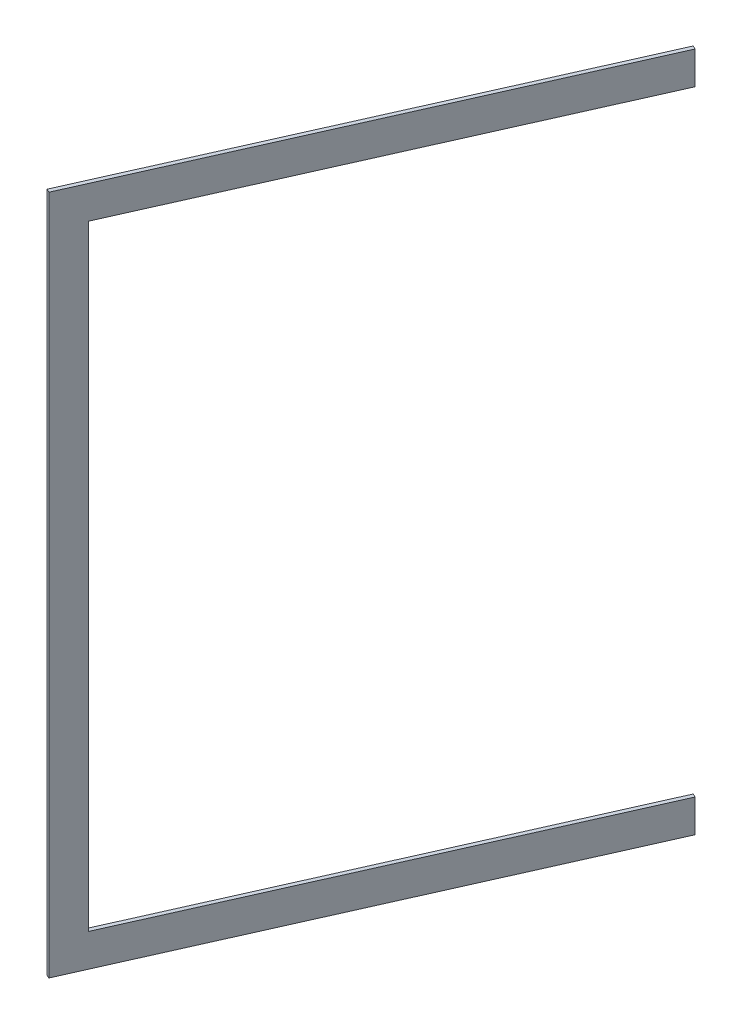
ISO-10303-21;
HEADER;
FILE_DESCRIPTION(('STEP AP214'),'2;1');
FILE_NAME('part.step','',(''),(''),'','','');
FILE_SCHEMA(('AUTOMOTIVE_DESIGN { 1 0 10303 214 1 1 1 1 }'));
ENDSEC;
DATA;
#1=APPLICATION_CONTEXT('core data for automotive mechanical design processes');
#2=APPLICATION_PROTOCOL_DEFINITION('international standard','automotive_design',2000,#1);
#3=PRODUCT_CONTEXT('',#1,'mechanical');
#4=PRODUCT('Part','Part','',(#3));
#5=PRODUCT_RELATED_PRODUCT_CATEGORY('part','',(#4));
#6=PRODUCT_DEFINITION_FORMATION('','',#4);
#7=PRODUCT_DEFINITION_CONTEXT('part definition',#1,'design');
#8=PRODUCT_DEFINITION('design','',#6,#7);
#9=PRODUCT_DEFINITION_SHAPE('','',#8);
#10=(LENGTH_UNIT() NAMED_UNIT(*) SI_UNIT(.MILLI.,.METRE.));
#11=(NAMED_UNIT(*) PLANE_ANGLE_UNIT() SI_UNIT($,.RADIAN.));
#12=(NAMED_UNIT(*) SI_UNIT($,.STERADIAN.) SOLID_ANGLE_UNIT());
#13=UNCERTAINTY_MEASURE_WITH_UNIT(LENGTH_MEASURE(1.E-05),#10,'distance_accuracy_value','');
#14=(GEOMETRIC_REPRESENTATION_CONTEXT(3) GLOBAL_UNCERTAINTY_ASSIGNED_CONTEXT((#13)) GLOBAL_UNIT_ASSIGNED_CONTEXT((#10,
#11,#12)) REPRESENTATION_CONTEXT('',''));
#15=CARTESIAN_POINT('',(0.,0.,0.));
#16=DIRECTION('',(0.,0.,1.));
#17=DIRECTION('',(1.,0.,0.));
#18=AXIS2_PLACEMENT_3D('',#15,#16,#17);
#19=CARTESIAN_POINT('',(440.298141294768,-2540.0250000008,1615.47743897948));
#20=DIRECTION('',(0.913545457642601,0.,0.4067366430758));
#21=DIRECTION('',(0.4067366430758,0.,-0.913545457642601));
#22=AXIS2_PLACEMENT_3D('',#19,#20,#21);
#23=PLANE('',#22);
#24=DIRECTION('',(0.406736643076131,0.,-0.913545457642454));
#25=VECTOR('',#24,1.);
#26=CARTESIAN_POINT('',(355.48626156987,-2241.55,1805.96803970516));
#27=LINE('',#26,#25);
#28=CARTESIAN_POINT('',(355.486261569905,-2241.55000000001,1805.96803970518));
#29=VERTEX_POINT('',#28);
#30=CARTESIAN_POINT('',(536.880608193707,-2241.55,1398.54966661008));
#31=VERTEX_POINT('',#30);
#32=EDGE_CURVE('E90',#29,#31,#27,.T.);
#33=ORIENTED_EDGE('',*,*,#32,.T.);
#34=DIRECTION('',(0.,1.,0.));
#35=VECTOR('',#34,1.);
#36=CARTESIAN_POINT('',(536.88060819371,-1953.1600000001,1398.54966661008));
#37=LINE('',#36,#35);
#38=CARTESIAN_POINT('',(536.880608193707,-2209.8,1398.54966661008));
#39=VERTEX_POINT('',#38);
#40=EDGE_CURVE('E20',#31,#39,#37,.T.);
#41=ORIENTED_EDGE('',*,*,#40,.T.);
#42=DIRECTION('',(0.406736643075846,0.,-0.91354545764258));
#43=VECTOR('',#42,1.);
#44=CARTESIAN_POINT('',(343.688837465502,-2209.8,1832.46548808125));
#45=LINE('',#44,#43);
#46=CARTESIAN_POINT('',(343.688837465506,-2209.8,1832.46548808125));
#47=VERTEX_POINT('',#46);
#48=EDGE_CURVE('E79',#47,#39,#45,.T.);
#49=ORIENTED_EDGE('',*,*,#48,.F.);
#50=DIRECTION('',(0.,1.,0.));
#51=VECTOR('',#50,1.);
#52=CARTESIAN_POINT('',(343.688837465502,-3126.84000000066,1832.46548808125));
#53=LINE('',#52,#51);
#54=CARTESIAN_POINT('',(343.688837465506,-2870.2,1832.46548808125));
#55=VERTEX_POINT('',#54);
#56=EDGE_CURVE('E98',#47,#55,#53,.F.);
#57=ORIENTED_EDGE('',*,*,#56,.T.);
#58=DIRECTION('',(0.406736643075846,0.,-0.91354545764258));
#59=VECTOR('',#58,1.);
#60=CARTESIAN_POINT('',(343.688837465502,-2870.2,1832.46548808125));
#61=LINE('',#60,#59);
#62=CARTESIAN_POINT('',(536.880608193707,-2870.2,1398.54966661008));
#63=VERTEX_POINT('',#62);
#64=EDGE_CURVE('E105',#55,#63,#61,.T.);
#65=ORIENTED_EDGE('',*,*,#64,.T.);
#66=DIRECTION('',(0.,1.,0.));
#67=VECTOR('',#66,1.);
#68=CARTESIAN_POINT('',(536.88060819371,-3126.84000000066,1398.54966661008));
#69=LINE('',#68,#67);
#70=CARTESIAN_POINT('',(536.880608193707,-2838.45,1398.54966661008));
#71=VERTEX_POINT('',#70);
#72=EDGE_CURVE('E108',#71,#63,#69,.F.);
#73=ORIENTED_EDGE('',*,*,#72,.F.);
#74=DIRECTION('',(0.406736643076131,0.,-0.913545457642454));
#75=VECTOR('',#74,1.);
#76=CARTESIAN_POINT('',(355.48626156987,-2838.45,1805.96803970516));
#77=LINE('',#76,#75);
#78=CARTESIAN_POINT('',(355.486261569905,-2838.45000000001,1805.96803970518));
#79=VERTEX_POINT('',#78);
#80=EDGE_CURVE('E112',#79,#71,#77,.T.);
#81=ORIENTED_EDGE('',*,*,#80,.F.);
#82=DIRECTION('',(0.,1.,0.));
#83=VECTOR('',#82,1.);
#84=CARTESIAN_POINT('',(355.48626156987,497460.000000032,1805.96803970516));
#85=LINE('',#84,#83);
#86=EDGE_CURVE('E119',#79,#29,#85,.T.);
#87=ORIENTED_EDGE('',*,*,#86,.T.);
#88=EDGE_LOOP('',(#33,#41,#49,#57,#65,#73,#81,#87));
#89=FACE_BOUND('',#88,.T.);
#90=ADVANCED_FACE('F17',(#89),#23,.T.);
#91=CARTESIAN_POINT('',(536.88060819371,-1953.1600000001,1398.54966661008));
#92=DIRECTION('',(-0.4067366430758,0.,0.913545457642601));
#93=DIRECTION('',(0.913545457642601,0.,0.4067366430758));
#94=AXIS2_PLACEMENT_3D('',#91,#92,#93);
#95=PLANE('',#94);
#96=ORIENTED_EDGE('',*,*,#40,.F.);
#97=DIRECTION('',(-0.913545457649993,0.,-0.406736643059198));
#98=VECTOR('',#97,1.);
#99=CARTESIAN_POINT('',(536.88060819371,-2241.55,1398.54966661008));
#100=LINE('',#99,#98);
#101=CARTESIAN_POINT('',(533.400000000012,-2241.55,1396.99999999997));
#102=VERTEX_POINT('',#101);
#103=EDGE_CURVE('E123',#31,#102,#100,.T.);
#104=ORIENTED_EDGE('',*,*,#103,.T.);
#105=DIRECTION('',(0.,1.,0.));
#106=VECTOR('',#105,1.);
#107=CARTESIAN_POINT('',(533.399999999994,-2540.0250000008,1397.));
#108=LINE('',#107,#106);
#109=CARTESIAN_POINT('',(533.400000000012,-2209.8,1396.99999999997));
#110=VERTEX_POINT('',#109);
#111=EDGE_CURVE('E96',#102,#110,#108,.T.);
#112=ORIENTED_EDGE('',*,*,#111,.T.);
#113=DIRECTION('',(-0.913545457649993,0.,-0.406736643059198));
#114=VECTOR('',#113,1.);
#115=CARTESIAN_POINT('',(536.88060819371,-2209.8,1398.54966661008));
#116=LINE('',#115,#114);
#117=EDGE_CURVE('E86',#39,#110,#116,.T.);
#118=ORIENTED_EDGE('',*,*,#117,.F.);
#119=EDGE_LOOP('',(#96,#104,#112,#118));
#120=FACE_BOUND('',#119,.T.);
#121=ADVANCED_FACE('F95',(#120),#95,.F.);
#122=CARTESIAN_POINT('',(536.88060819371,-2209.8,1398.54966661008));
#123=DIRECTION('',(0.,1.,0.));
#124=DIRECTION('',(0.,0.,1.));
#125=AXIS2_PLACEMENT_3D('',#122,#123,#124);
#126=PLANE('',#125);
#127=ORIENTED_EDGE('',*,*,#117,.T.);
#128=DIRECTION('',(0.4067366430758,0.,-0.913545457642601));
#129=VECTOR('',#128,1.);
#130=CARTESIAN_POINT('',(436.817533101058,-2209.8,1613.92777236939));
#131=LINE('',#130,#129);
#132=CARTESIAN_POINT('',(340.208229271803,-2209.8,1830.91582147115));
#133=VERTEX_POINT('',#132);
#134=EDGE_CURVE('E126',#110,#133,#131,.F.);
#135=ORIENTED_EDGE('',*,*,#134,.T.);
#136=DIRECTION('',(-0.913545457642601,0.,-0.4067366430758));
#137=VECTOR('',#136,1.);
#138=CARTESIAN_POINT('',(343.688837465502,-2209.8,1832.46548808125));
#139=LINE('',#138,#137);
#140=EDGE_CURVE('E88',#133,#47,#139,.F.);
#141=ORIENTED_EDGE('',*,*,#140,.T.);
#142=ORIENTED_EDGE('',*,*,#48,.T.);
#143=EDGE_LOOP('',(#127,#135,#141,#142));
#144=FACE_BOUND('',#143,.T.);
#145=ADVANCED_FACE('F83',(#144),#126,.T.);
#146=CARTESIAN_POINT('',(343.688837465502,-3126.84000000066,1832.46548808125));
#147=DIRECTION('',(0.4067366430758,0.,-0.913545457642601));
#148=DIRECTION('',(-0.913545457642601,0.,-0.4067366430758));
#149=AXIS2_PLACEMENT_3D('',#146,#147,#148);
#150=PLANE('',#149);
#151=ORIENTED_EDGE('',*,*,#56,.F.);
#152=ORIENTED_EDGE('',*,*,#140,.F.);
#153=DIRECTION('',(0.,1.,0.));
#154=VECTOR('',#153,1.);
#155=CARTESIAN_POINT('',(340.208229271808,-2540.0250000008,1830.91582147117));
#156=LINE('',#155,#154);
#157=CARTESIAN_POINT('',(340.20822927181,-2870.2,1830.91582147114));
#158=VERTEX_POINT('',#157);
#159=EDGE_CURVE('E128',#133,#158,#156,.F.);
#160=ORIENTED_EDGE('',*,*,#159,.T.);
#161=DIRECTION('',(0.913545457649971,0.,0.406736643059246));
#162=VECTOR('',#161,1.);
#163=CARTESIAN_POINT('',(340.208229271792,-2870.2,1830.91582147117));
#164=LINE('',#163,#162);
#165=EDGE_CURVE('E102',#158,#55,#164,.T.);
#166=ORIENTED_EDGE('',*,*,#165,.T.);
#167=EDGE_LOOP('',(#151,#152,#160,#166));
#168=FACE_BOUND('',#167,.T.);
#169=ADVANCED_FACE('F162',(#168),#150,.F.);
#170=CARTESIAN_POINT('',(536.88060819371,-2870.2,1398.54966661008));
#171=DIRECTION('',(0.,1.,0.));
#172=DIRECTION('',(0.,0.,1.));
#173=AXIS2_PLACEMENT_3D('',#170,#171,#172);
#174=PLANE('',#173);
#175=ORIENTED_EDGE('',*,*,#64,.F.);
#176=ORIENTED_EDGE('',*,*,#165,.F.);
#177=DIRECTION('',(0.4067366430758,0.,-0.913545457642601));
#178=VECTOR('',#177,1.);
#179=CARTESIAN_POINT('',(436.817533101058,-2870.2,1613.92777236939));
#180=LINE('',#179,#178);
#181=CARTESIAN_POINT('',(533.400000000005,-2870.2,1396.99999999998));
#182=VERTEX_POINT('',#181);
#183=EDGE_CURVE('E131',#158,#182,#180,.T.);
#184=ORIENTED_EDGE('',*,*,#183,.T.);
#185=DIRECTION('',(-0.913545457642601,0.,-0.4067366430758));
#186=VECTOR('',#185,1.);
#187=CARTESIAN_POINT('',(536.88060819371,-2870.2,1398.54966661008));
#188=LINE('',#187,#186);
#189=EDGE_CURVE('E110',#63,#182,#188,.T.);
#190=ORIENTED_EDGE('',*,*,#189,.F.);
#191=EDGE_LOOP('',(#175,#176,#184,#190));
#192=FACE_BOUND('',#191,.T.);
#193=ADVANCED_FACE('F160',(#192),#174,.F.);
#194=CARTESIAN_POINT('',(536.88060819371,-3126.84000000066,1398.54966661008));
#195=DIRECTION('',(0.4067366430758,0.,-0.913545457642601));
#196=DIRECTION('',(-0.913545457642601,0.,-0.4067366430758));
#197=AXIS2_PLACEMENT_3D('',#194,#195,#196);
#198=PLANE('',#197);
#199=ORIENTED_EDGE('',*,*,#189,.T.);
#200=DIRECTION('',(0.,1.,0.));
#201=VECTOR('',#200,1.);
#202=CARTESIAN_POINT('',(533.399999999994,-2540.0250000008,1397.));
#203=LINE('',#202,#201);
#204=CARTESIAN_POINT('',(533.400000000012,-2838.45,1396.99999999997));
#205=VERTEX_POINT('',#204);
#206=EDGE_CURVE('E134',#182,#205,#203,.T.);
#207=ORIENTED_EDGE('',*,*,#206,.T.);
#208=DIRECTION('',(-0.913545457649993,0.,-0.406736643059198));
#209=VECTOR('',#208,1.);
#210=CARTESIAN_POINT('',(536.88060819371,-2838.45,1398.54966661008));
#211=LINE('',#210,#209);
#212=EDGE_CURVE('E114',#71,#205,#211,.T.);
#213=ORIENTED_EDGE('',*,*,#212,.F.);
#214=ORIENTED_EDGE('',*,*,#72,.T.);
#215=EDGE_LOOP('',(#199,#207,#213,#214));
#216=FACE_BOUND('',#215,.T.);
#217=ADVANCED_FACE('F154',(#216),#198,.T.);
#218=CARTESIAN_POINT('',(536.88060819371,-2838.45,1398.54966661008));
#219=DIRECTION('',(0.,1.,0.));
#220=DIRECTION('',(0.,0.,1.));
#221=AXIS2_PLACEMENT_3D('',#218,#219,#220);
#222=PLANE('',#221);
#223=ORIENTED_EDGE('',*,*,#212,.T.);
#224=DIRECTION('',(0.4067366430758,0.,-0.913545457642601));
#225=VECTOR('',#224,1.);
#226=CARTESIAN_POINT('',(436.817533101058,-2838.45,1613.92777236939));
#227=LINE('',#226,#225);
#228=CARTESIAN_POINT('',(352.005653376393,-2838.45000000001,1804.41837309508));
#229=VERTEX_POINT('',#228);
#230=EDGE_CURVE('E137',#205,#229,#227,.F.);
#231=ORIENTED_EDGE('',*,*,#230,.T.);
#232=DIRECTION('',(0.913545457642601,0.,0.4067366430758));
#233=VECTOR('',#232,1.);
#234=CARTESIAN_POINT('',(355.48626156987,-2838.45000000002,1805.96803970516));
#235=LINE('',#234,#233);
#236=EDGE_CURVE('E116',#229,#79,#235,.T.);
#237=ORIENTED_EDGE('',*,*,#236,.T.);
#238=ORIENTED_EDGE('',*,*,#80,.T.);
#239=EDGE_LOOP('',(#223,#231,#237,#238));
#240=FACE_BOUND('',#239,.T.);
#241=ADVANCED_FACE('F150',(#240),#222,.T.);
#242=CARTESIAN_POINT('',(355.48626156987,497460.000000032,1805.96803970516));
#243=DIRECTION('',(-0.4067366430758,0.,0.913545457642601));
#244=DIRECTION('',(0.913545457642601,0.,0.4067366430758));
#245=AXIS2_PLACEMENT_3D('',#242,#243,#244);
#246=PLANE('',#245);
#247=ORIENTED_EDGE('',*,*,#86,.F.);
#248=ORIENTED_EDGE('',*,*,#236,.F.);
#249=DIRECTION('',(0.,1.,0.));
#250=VECTOR('',#249,1.);
#251=CARTESIAN_POINT('',(352.005653376343,-2540.0250000008,1804.41837309504));
#252=LINE('',#251,#250);
#253=CARTESIAN_POINT('',(352.005653376389,-2241.55000000001,1804.41837309508));
#254=VERTEX_POINT('',#253);
#255=EDGE_CURVE('E26',#229,#254,#252,.T.);
#256=ORIENTED_EDGE('',*,*,#255,.T.);
#257=DIRECTION('',(0.913545457638944,0.,0.406736643084014));
#258=VECTOR('',#257,1.);
#259=CARTESIAN_POINT('',(352.005653376414,-2241.55,1804.41837309508));
#260=LINE('',#259,#258);
#261=EDGE_CURVE('E34',#254,#29,#260,.T.);
#262=ORIENTED_EDGE('',*,*,#261,.T.);
#263=EDGE_LOOP('',(#247,#248,#256,#262));
#264=FACE_BOUND('',#263,.T.);
#265=ADVANCED_FACE('F144',(#264),#246,.F.);
#266=CARTESIAN_POINT('',(536.88060819371,-2241.55,1398.54966661008));
#267=DIRECTION('',(0.,1.,0.));
#268=DIRECTION('',(0.,0.,1.));
#269=AXIS2_PLACEMENT_3D('',#266,#267,#268);
#270=PLANE('',#269);
#271=ORIENTED_EDGE('',*,*,#32,.F.);
#272=ORIENTED_EDGE('',*,*,#261,.F.);
#273=DIRECTION('',(0.4067366430758,0.,-0.913545457642601));
#274=VECTOR('',#273,1.);
#275=CARTESIAN_POINT('',(436.817533101058,-2241.55,1613.92777236939));
#276=LINE('',#275,#274);
#277=EDGE_CURVE('E11',#254,#102,#276,.T.);
#278=ORIENTED_EDGE('',*,*,#277,.T.);
#279=ORIENTED_EDGE('',*,*,#103,.F.);
#280=EDGE_LOOP('',(#271,#272,#278,#279));
#281=FACE_BOUND('',#280,.T.);
#282=ADVANCED_FACE('F163',(#281),#270,.F.);
#283=CARTESIAN_POINT('',(436.817533101058,-2540.0250000008,1613.92777236939));
#284=DIRECTION('',(0.913545457642601,0.,0.4067366430758));
#285=DIRECTION('',(0.4067366430758,0.,-0.913545457642601));
#286=AXIS2_PLACEMENT_3D('',#283,#284,#285);
#287=PLANE('',#286);
#288=ORIENTED_EDGE('',*,*,#255,.F.);
#289=ORIENTED_EDGE('',*,*,#230,.F.);
#290=ORIENTED_EDGE('',*,*,#206,.F.);
#291=ORIENTED_EDGE('',*,*,#183,.F.);
#292=ORIENTED_EDGE('',*,*,#159,.F.);
#293=ORIENTED_EDGE('',*,*,#134,.F.);
#294=ORIENTED_EDGE('',*,*,#111,.F.);
#295=ORIENTED_EDGE('',*,*,#277,.F.);
#296=EDGE_LOOP('',(#288,#289,#290,#291,#292,#293,#294,#295));
#297=FACE_BOUND('',#296,.T.);
#298=ADVANCED_FACE('F147',(#297),#287,.F.);
#299=CLOSED_SHELL('',(#90,#121,#145,#169,#193,#217,#241,#265,#282,#298));
#300=MANIFOLD_SOLID_BREP('B1',#299);
#301=ADVANCED_BREP_SHAPE_REPRESENTATION('',(#18,#300),#14);
#302=SHAPE_DEFINITION_REPRESENTATION(#9,#301);
ENDSEC;
END-ISO-10303-21;
